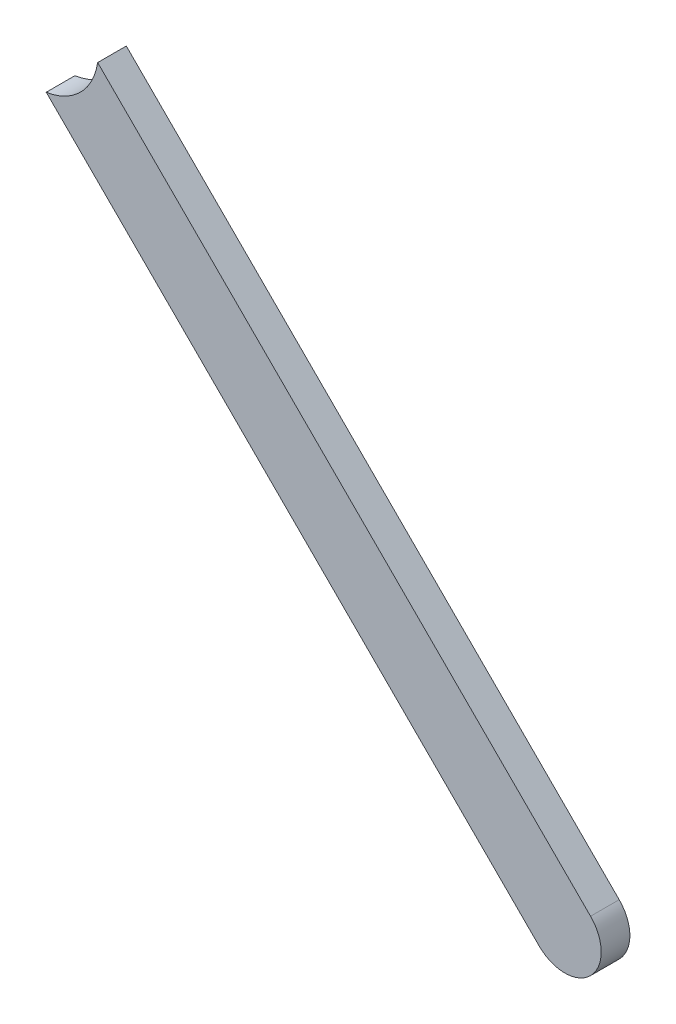
ISO-10303-21;
HEADER;
FILE_DESCRIPTION(('STEP AP214'),'2;1');
FILE_NAME('part.step','',(''),(''),'','','');
FILE_SCHEMA(('AUTOMOTIVE_DESIGN { 1 0 10303 214 1 1 1 1 }'));
ENDSEC;
DATA;
#1=APPLICATION_CONTEXT('core data for automotive mechanical design processes');
#2=APPLICATION_PROTOCOL_DEFINITION('international standard','automotive_design',2000,#1);
#3=PRODUCT_CONTEXT('',#1,'mechanical');
#4=PRODUCT('Part','Part','',(#3));
#5=PRODUCT_RELATED_PRODUCT_CATEGORY('part','',(#4));
#6=PRODUCT_DEFINITION_FORMATION('','',#4);
#7=PRODUCT_DEFINITION_CONTEXT('part definition',#1,'design');
#8=PRODUCT_DEFINITION('design','',#6,#7);
#9=PRODUCT_DEFINITION_SHAPE('','',#8);
#10=(LENGTH_UNIT() NAMED_UNIT(*) SI_UNIT(.MILLI.,.METRE.));
#11=(NAMED_UNIT(*) PLANE_ANGLE_UNIT() SI_UNIT($,.RADIAN.));
#12=(NAMED_UNIT(*) SI_UNIT($,.STERADIAN.) SOLID_ANGLE_UNIT());
#13=UNCERTAINTY_MEASURE_WITH_UNIT(LENGTH_MEASURE(1.E-05),#10,'distance_accuracy_value','');
#14=(GEOMETRIC_REPRESENTATION_CONTEXT(3) GLOBAL_UNCERTAINTY_ASSIGNED_CONTEXT((#13)) GLOBAL_UNIT_ASSIGNED_CONTEXT((#10,
#11,#12)) REPRESENTATION_CONTEXT('',''));
#15=CARTESIAN_POINT('',(0.,0.,0.));
#16=DIRECTION('',(0.,0.,1.));
#17=DIRECTION('',(1.,0.,0.));
#18=AXIS2_PLACEMENT_3D('',#15,#16,#17);
#19=CARTESIAN_POINT('',(135.062341052133,118.324449607867,0.));
#20=DIRECTION('',(0.707106781186549,0.707106781186546,0.));
#21=DIRECTION('',(0.707106781186546,-0.707106781186549,0.));
#22=AXIS2_PLACEMENT_3D('',#19,#20,#21);
#23=PLANE('',#22);
#24=DIRECTION('',(0.707106781186546,-0.707106781186549,0.));
#25=VECTOR('',#24,1.);
#26=CARTESIAN_POINT('',(133.61339546,119.7733952,0.1999996));
#27=LINE('',#26,#25);
#28=CARTESIAN_POINT('',(135.062341052133,118.324449607867,0.1999996));
#29=VERTEX_POINT('',#28);
#30=CARTESIAN_POINT('',(138.50439406,114.8823966,0.1999996));
#31=VERTEX_POINT('',#30);
#32=EDGE_CURVE('E11',#29,#31,#27,.T.);
#33=ORIENTED_EDGE('',*,*,#32,.F.);
#34=DIRECTION('',(0.,0.,1.));
#35=VECTOR('',#34,1.);
#36=CARTESIAN_POINT('',(135.062341052133,118.324449607867,0.));
#37=LINE('',#36,#35);
#38=CARTESIAN_POINT('',(135.062341052133,118.324449607867,0.));
#39=VERTEX_POINT('',#38);
#40=EDGE_CURVE('E24',#39,#29,#37,.T.);
#41=ORIENTED_EDGE('',*,*,#40,.F.);
#42=DIRECTION('',(0.707106781186546,-0.707106781186549,0.));
#43=VECTOR('',#42,1.);
#44=CARTESIAN_POINT('',(133.61339546,119.7733952,0.));
#45=LINE('',#44,#43);
#46=CARTESIAN_POINT('',(138.50439406,114.8823966,0.));
#47=VERTEX_POINT('',#46);
#48=EDGE_CURVE('E75',#39,#47,#45,.T.);
#49=ORIENTED_EDGE('',*,*,#48,.T.);
#50=DIRECTION('',(0.,0.,1.));
#51=VECTOR('',#50,1.);
#52=CARTESIAN_POINT('',(138.50439406,114.8823966,0.));
#53=LINE('',#52,#51);
#54=EDGE_CURVE('E37',#47,#31,#53,.T.);
#55=ORIENTED_EDGE('',*,*,#54,.T.);
#56=EDGE_LOOP('',(#33,#41,#49,#55));
#57=FACE_BOUND('',#56,.T.);
#58=ADVANCED_FACE('F17',(#57),#23,.F.);
#59=CARTESIAN_POINT('',(138.684,115.06200127,0.));
#60=DIRECTION('',(0.,0.,-1.));
#61=DIRECTION('',(-0.707109281179584,-0.707104281184673,0.));
#62=AXIS2_PLACEMENT_3D('',#59,#60,#61);
#63=CYLINDRICAL_SURFACE('',#62,0.254000258206741);
#64=CARTESIAN_POINT('',(138.684,115.06200127,0.1999996));
#65=DIRECTION('',(0.,0.,1.));
#66=DIRECTION('',(-0.707109281179584,-0.707104281184673,0.));
#67=AXIS2_PLACEMENT_3D('',#64,#65,#66);
#68=CIRCLE('',#67,0.254000258206741);
#69=CARTESIAN_POINT('',(138.86360594,115.24160594,0.1999996));
#70=VERTEX_POINT('',#69);
#71=EDGE_CURVE('E83',#31,#70,#68,.T.);
#72=ORIENTED_EDGE('',*,*,#71,.F.);
#73=ORIENTED_EDGE('',*,*,#54,.F.);
#74=CARTESIAN_POINT('',(138.684,115.06200127,0.));
#75=DIRECTION('',(0.,0.,1.));
#76=DIRECTION('',(-0.707109281179584,-0.707104281184673,0.));
#77=AXIS2_PLACEMENT_3D('',#74,#75,#76);
#78=CIRCLE('',#77,0.254000258206741);
#79=CARTESIAN_POINT('',(138.86360594,115.24160594,0.));
#80=VERTEX_POINT('',#79);
#81=EDGE_CURVE('E81',#47,#80,#78,.T.);
#82=ORIENTED_EDGE('',*,*,#81,.T.);
#83=DIRECTION('',(0.,0.,1.));
#84=VECTOR('',#83,1.);
#85=CARTESIAN_POINT('',(138.86360594,115.24160594,0.));
#86=LINE('',#85,#84);
#87=EDGE_CURVE('E67',#80,#70,#86,.T.);
#88=ORIENTED_EDGE('',*,*,#87,.T.);
#89=EDGE_LOOP('',(#72,#73,#82,#88));
#90=FACE_BOUND('',#89,.T.);
#91=ADVANCED_FACE('F89',(#90),#63,.T.);
#92=CARTESIAN_POINT('',(138.86360594,115.24160594,0.));
#93=DIRECTION('',(-0.707106781186549,-0.707106781186546,0.));
#94=DIRECTION('',(-0.707106781186546,0.707106781186549,0.));
#95=AXIS2_PLACEMENT_3D('',#92,#93,#94);
#96=PLANE('',#95);
#97=DIRECTION('',(-0.707106781186546,0.707106781186549,0.));
#98=VECTOR('',#97,1.);
#99=CARTESIAN_POINT('',(138.86360594,115.24160594,0.1999996));
#100=LINE('',#99,#98);
#101=CARTESIAN_POINT('',(135.42155071545,118.68366116455,0.1999996));
#102=VERTEX_POINT('',#101);
#103=EDGE_CURVE('E71',#70,#102,#100,.T.);
#104=ORIENTED_EDGE('',*,*,#103,.F.);
#105=ORIENTED_EDGE('',*,*,#87,.F.);
#106=DIRECTION('',(-0.707106781186546,0.707106781186549,0.));
#107=VECTOR('',#106,1.);
#108=CARTESIAN_POINT('',(138.86360594,115.24160594,0.));
#109=LINE('',#108,#107);
#110=CARTESIAN_POINT('',(135.42155071545,118.68366116455,0.));
#111=VERTEX_POINT('',#110);
#112=EDGE_CURVE('E63',#80,#111,#109,.T.);
#113=ORIENTED_EDGE('',*,*,#112,.T.);
#114=DIRECTION('',(0.,0.,1.));
#115=VECTOR('',#114,1.);
#116=CARTESIAN_POINT('',(135.42155071545,118.68366116455,0.));
#117=LINE('',#116,#115);
#118=EDGE_CURVE('E53',#111,#102,#117,.T.);
#119=ORIENTED_EDGE('',*,*,#118,.T.);
#120=EDGE_LOOP('',(#104,#105,#113,#119));
#121=FACE_BOUND('',#120,.T.);
#122=ADVANCED_FACE('F66',(#121),#96,.F.);
#123=CARTESIAN_POINT('',(135.001,118.745,0.));
#124=DIRECTION('',(0.,0.,-1.));
#125=DIRECTION('',(1.,0.,0.));
#126=AXIS2_PLACEMENT_3D('',#123,#124,#125);
#127=CYLINDRICAL_SURFACE('',#126,0.42500042);
#128=ORIENTED_EDGE('',*,*,#40,.T.);
#129=CARTESIAN_POINT('',(135.001,118.745,0.1999996));
#130=DIRECTION('',(0.,0.,1.));
#131=DIRECTION('',(1.,0.,0.));
#132=AXIS2_PLACEMENT_3D('',#129,#130,#131);
#133=CIRCLE('',#132,0.42500042);
#134=EDGE_CURVE('E59',#29,#102,#133,.T.);
#135=ORIENTED_EDGE('',*,*,#134,.T.);
#136=ORIENTED_EDGE('',*,*,#118,.F.);
#137=CARTESIAN_POINT('',(135.001,118.745,0.));
#138=DIRECTION('',(0.,0.,1.));
#139=DIRECTION('',(1.,0.,0.));
#140=AXIS2_PLACEMENT_3D('',#137,#138,#139);
#141=CIRCLE('',#140,0.42500042);
#142=EDGE_CURVE('E57',#39,#111,#141,.T.);
#143=ORIENTED_EDGE('',*,*,#142,.F.);
#144=EDGE_LOOP('',(#128,#135,#136,#143));
#145=FACE_BOUND('',#144,.T.);
#146=ADVANCED_FACE('F55',(#145),#127,.F.);
#147=CARTESIAN_POINT('',(133.61339546,119.7733952,0.));
#148=DIRECTION('',(0.,0.,-1.));
#149=DIRECTION('',(-1.,0.,0.));
#150=AXIS2_PLACEMENT_3D('',#147,#148,#149);
#151=PLANE('',#150);
#152=ORIENTED_EDGE('',*,*,#48,.F.);
#153=ORIENTED_EDGE('',*,*,#142,.T.);
#154=ORIENTED_EDGE('',*,*,#112,.F.);
#155=ORIENTED_EDGE('',*,*,#81,.F.);
#156=EDGE_LOOP('',(#152,#153,#154,#155));
#157=FACE_BOUND('',#156,.T.);
#158=ADVANCED_FACE('F74',(#157),#151,.T.);
#159=CARTESIAN_POINT('',(133.61339546,119.7733952,0.1999996));
#160=DIRECTION('',(0.,0.,-1.));
#161=DIRECTION('',(-1.,0.,0.));
#162=AXIS2_PLACEMENT_3D('',#159,#160,#161);
#163=PLANE('',#162);
#164=ORIENTED_EDGE('',*,*,#134,.F.);
#165=ORIENTED_EDGE('',*,*,#32,.T.);
#166=ORIENTED_EDGE('',*,*,#71,.T.);
#167=ORIENTED_EDGE('',*,*,#103,.T.);
#168=EDGE_LOOP('',(#164,#165,#166,#167));
#169=FACE_BOUND('',#168,.T.);
#170=ADVANCED_FACE('F91',(#169),#163,.F.);
#171=CLOSED_SHELL('',(#58,#91,#122,#146,#158,#170));
#172=MANIFOLD_SOLID_BREP('B1',#171);
#173=ADVANCED_BREP_SHAPE_REPRESENTATION('',(#18,#172),#14);
#174=SHAPE_DEFINITION_REPRESENTATION(#9,#173);
ENDSEC;
END-ISO-10303-21;
